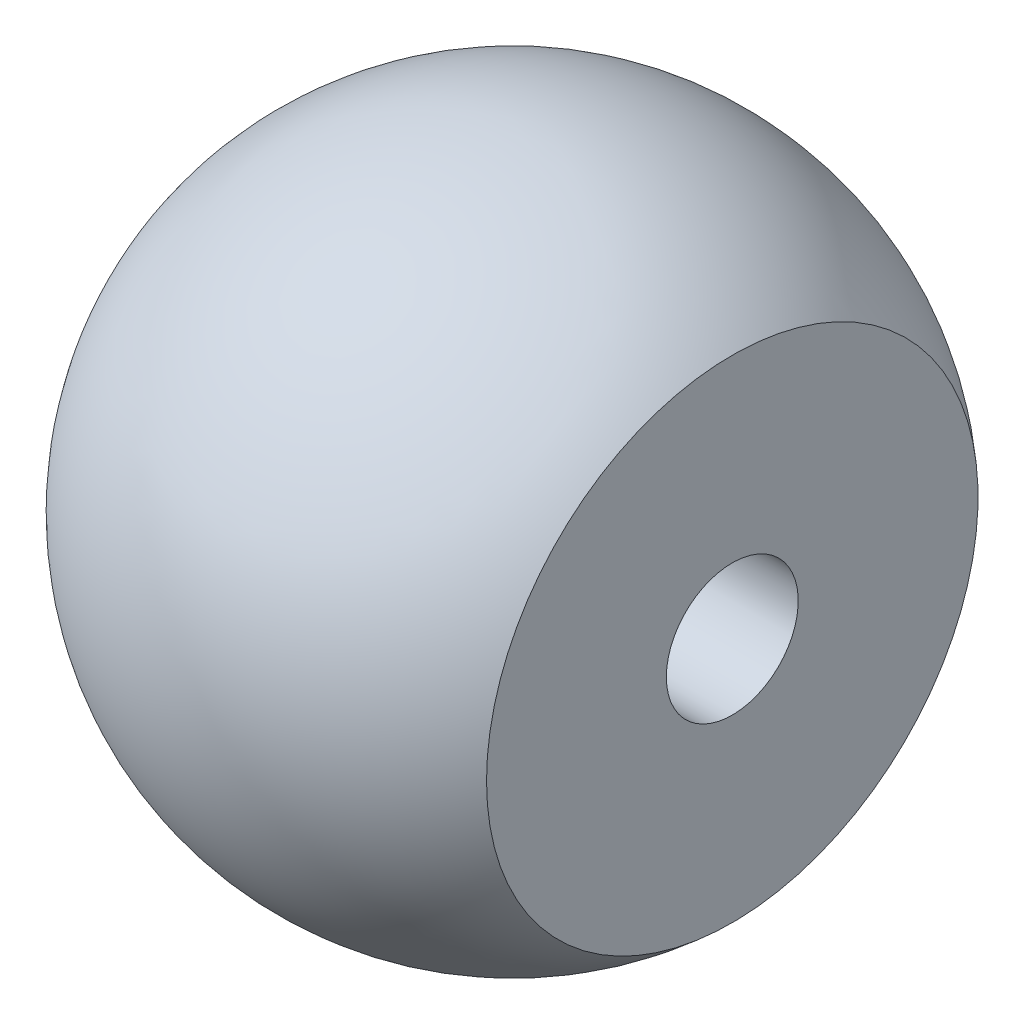
ISO-10303-21;
HEADER;
FILE_DESCRIPTION(('STEP AP214'),'2;1');
FILE_NAME('part.step','',(''),(''),'','','');
FILE_SCHEMA(('AUTOMOTIVE_DESIGN { 1 0 10303 214 1 1 1 1 }'));
ENDSEC;
DATA;
#1=APPLICATION_CONTEXT('core data for automotive mechanical design processes');
#2=APPLICATION_PROTOCOL_DEFINITION('international standard','automotive_design',2000,#1);
#3=PRODUCT_CONTEXT('',#1,'mechanical');
#4=PRODUCT('Part','Part','',(#3));
#5=PRODUCT_RELATED_PRODUCT_CATEGORY('part','',(#4));
#6=PRODUCT_DEFINITION_FORMATION('','',#4);
#7=PRODUCT_DEFINITION_CONTEXT('part definition',#1,'design');
#8=PRODUCT_DEFINITION('design','',#6,#7);
#9=PRODUCT_DEFINITION_SHAPE('','',#8);
#10=(LENGTH_UNIT() NAMED_UNIT(*) SI_UNIT(.MILLI.,.METRE.));
#11=(NAMED_UNIT(*) PLANE_ANGLE_UNIT() SI_UNIT($,.RADIAN.));
#12=(NAMED_UNIT(*) SI_UNIT($,.STERADIAN.) SOLID_ANGLE_UNIT());
#13=UNCERTAINTY_MEASURE_WITH_UNIT(LENGTH_MEASURE(1.E-05),#10,'distance_accuracy_value','');
#14=(GEOMETRIC_REPRESENTATION_CONTEXT(3) GLOBAL_UNCERTAINTY_ASSIGNED_CONTEXT((#13)) GLOBAL_UNIT_ASSIGNED_CONTEXT((#10,
#11,#12)) REPRESENTATION_CONTEXT('',''));
#15=CARTESIAN_POINT('',(0.,0.,0.));
#16=DIRECTION('',(0.,0.,1.));
#17=DIRECTION('',(1.,0.,0.));
#18=AXIS2_PLACEMENT_3D('',#15,#16,#17);
#19=CARTESIAN_POINT('',(0.,0.,0.));
#20=DIRECTION('',(0.,1.,0.));
#21=DIRECTION('',(1.,0.,0.));
#22=AXIS2_PLACEMENT_3D('',#19,#20,#21);
#23=SPHERICAL_SURFACE('',#22,30.);
#24=CARTESIAN_POINT('',(0.,0.,0.));
#25=DIRECTION('',(-1.,0.,0.));
#26=DIRECTION('',(0.,0.,1.));
#27=AXIS2_PLACEMENT_3D('',#24,#25,#26);
#28=SPHERICAL_SURFACE('',#27,30.);
#29=CARTESIAN_POINT('',(20.,0.,0.));
#30=DIRECTION('',(-1.,0.,0.));
#31=DIRECTION('',(0.,0.,1.));
#32=AXIS2_PLACEMENT_3D('',#29,#30,#31);
#33=CIRCLE('',#32,22.3606797749979);
#34=CARTESIAN_POINT('',(20.,0.,22.3606797749979));
#35=VERTEX_POINT('',#34);
#36=EDGE_CURVE('E10',#35,#35,#33,.T.);
#37=ORIENTED_EDGE('',*,*,#36,.T.);
#38=EDGE_LOOP('',(#37));
#39=FACE_BOUND('',#38,.T.);
#40=ADVANCED_FACE('F37',(#39),#28,.T.);
#41=CARTESIAN_POINT('',(20.,22.3606797749979,-30.));
#42=DIRECTION('',(-1.,0.,0.));
#43=DIRECTION('',(0.,0.,1.));
#44=AXIS2_PLACEMENT_3D('',#41,#42,#43);
#45=PLANE('',#44);
#46=CARTESIAN_POINT('',(20.,0.,0.));
#47=DIRECTION('',(-1.,0.,0.));
#48=DIRECTION('',(0.,0.,1.));
#49=AXIS2_PLACEMENT_3D('',#46,#47,#48);
#50=CIRCLE('',#49,6.);
#51=CARTESIAN_POINT('',(20.,0.,6.));
#52=VERTEX_POINT('',#51);
#53=EDGE_CURVE('E40',#52,#52,#50,.F.);
#54=ORIENTED_EDGE('',*,*,#53,.F.);
#55=EDGE_LOOP('',(#54));
#56=FACE_BOUND('',#55,.T.);
#57=ORIENTED_EDGE('',*,*,#36,.F.);
#58=EDGE_LOOP('',(#57));
#59=FACE_BOUND('',#58,.T.);
#60=ADVANCED_FACE('F57',(#56,#59),#45,.F.);
#61=CARTESIAN_POINT('',(20.000012,0.,0.));
#62=DIRECTION('',(-1.,0.,0.));
#63=DIRECTION('',(0.,0.,1.));
#64=AXIS2_PLACEMENT_3D('',#61,#62,#63);
#65=CYLINDRICAL_SURFACE('',#64,6.);
#66=CARTESIAN_POINT('',(8.,0.,0.));
#67=DIRECTION('',(1.,0.,0.));
#68=DIRECTION('',(0.,0.,-1.));
#69=AXIS2_PLACEMENT_3D('',#66,#67,#68);
#70=CIRCLE('',#69,6.);
#71=CARTESIAN_POINT('',(7.99999999999999,0.,6.));
#72=VERTEX_POINT('',#71);
#73=EDGE_CURVE('E47',#72,#72,#70,.T.);
#74=CARTESIAN_POINT('',(7.99999999999999,0.,6.));
#75=CARTESIAN_POINT('',(8.12499999999999,0.,6.));
#76=CARTESIAN_POINT('',(8.24999999999999,0.,6.));
#77=CARTESIAN_POINT('',(8.49999999999999,0.,6.));
#78=CARTESIAN_POINT('',(8.62499999999999,0.,6.));
#79=CARTESIAN_POINT('',(8.875,0.,6.));
#80=CARTESIAN_POINT('',(9.,0.,6.));
#81=CARTESIAN_POINT('',(9.25,0.,6.));
#82=CARTESIAN_POINT('',(9.375,0.,6.));
#83=CARTESIAN_POINT('',(9.625,0.,6.));
#84=CARTESIAN_POINT('',(9.75,0.,6.));
#85=CARTESIAN_POINT('',(10.,0.,6.));
#86=CARTESIAN_POINT('',(10.125,0.,6.));
#87=CARTESIAN_POINT('',(10.375,0.,6.));
#88=CARTESIAN_POINT('',(10.5,0.,6.));
#89=CARTESIAN_POINT('',(10.75,0.,6.));
#90=CARTESIAN_POINT('',(10.875,0.,6.));
#91=CARTESIAN_POINT('',(11.125,0.,6.));
#92=CARTESIAN_POINT('',(11.25,0.,6.));
#93=CARTESIAN_POINT('',(11.5,0.,6.));
#94=CARTESIAN_POINT('',(11.625,0.,6.));
#95=CARTESIAN_POINT('',(11.875,0.,6.));
#96=CARTESIAN_POINT('',(12.,0.,6.));
#97=CARTESIAN_POINT('',(12.25,0.,6.));
#98=CARTESIAN_POINT('',(12.375,0.,6.));
#99=CARTESIAN_POINT('',(12.625,0.,6.));
#100=CARTESIAN_POINT('',(12.75,0.,6.));
#101=CARTESIAN_POINT('',(13.,0.,6.));
#102=CARTESIAN_POINT('',(13.125,0.,6.));
#103=CARTESIAN_POINT('',(13.375,0.,6.));
#104=CARTESIAN_POINT('',(13.5,0.,6.));
#105=CARTESIAN_POINT('',(13.75,0.,6.));
#106=CARTESIAN_POINT('',(13.875,0.,6.));
#107=CARTESIAN_POINT('',(14.125,0.,6.));
#108=CARTESIAN_POINT('',(14.25,0.,6.));
#109=CARTESIAN_POINT('',(14.5,0.,6.));
#110=CARTESIAN_POINT('',(14.625,0.,6.));
#111=CARTESIAN_POINT('',(14.875,0.,6.));
#112=CARTESIAN_POINT('',(15.,0.,6.));
#113=CARTESIAN_POINT('',(15.25,0.,6.));
#114=CARTESIAN_POINT('',(15.375,0.,6.));
#115=CARTESIAN_POINT('',(15.625,0.,6.));
#116=CARTESIAN_POINT('',(15.75,0.,6.));
#117=CARTESIAN_POINT('',(16.,0.,6.));
#118=CARTESIAN_POINT('',(16.125,0.,6.));
#119=CARTESIAN_POINT('',(16.375,0.,6.));
#120=CARTESIAN_POINT('',(16.5,0.,6.));
#121=CARTESIAN_POINT('',(16.75,0.,6.));
#122=CARTESIAN_POINT('',(16.875,0.,6.));
#123=CARTESIAN_POINT('',(17.125,0.,6.));
#124=CARTESIAN_POINT('',(17.25,0.,6.));
#125=CARTESIAN_POINT('',(17.5,0.,6.));
#126=CARTESIAN_POINT('',(17.625,0.,6.));
#127=CARTESIAN_POINT('',(17.875,0.,6.));
#128=CARTESIAN_POINT('',(18.,0.,6.));
#129=CARTESIAN_POINT('',(18.25,0.,6.));
#130=CARTESIAN_POINT('',(18.375,0.,6.));
#131=CARTESIAN_POINT('',(18.625,0.,6.));
#132=CARTESIAN_POINT('',(18.75,0.,6.));
#133=CARTESIAN_POINT('',(19.,0.,6.));
#134=CARTESIAN_POINT('',(19.125,0.,6.));
#135=CARTESIAN_POINT('',(19.375,0.,6.));
#136=CARTESIAN_POINT('',(19.5,0.,6.));
#137=CARTESIAN_POINT('',(19.75,0.,6.));
#138=CARTESIAN_POINT('',(19.875,0.,6.));
#139=CARTESIAN_POINT('',(20.,0.,6.));
#140=B_SPLINE_CURVE_WITH_KNOTS('',3,(#74,#75,#76,#77,#78,#79,#80,#81,#82,#83,#84,#85,#86,#87,
#88,#89,#90,#91,#92,#93,#94,#95,#96,#97,#98,#99,#100,#101,#102,#103,#104,#105,#106,#107,#108,
#109,#110,#111,#112,#113,#114,#115,#116,#117,#118,#119,#120,#121,#122,#123,#124,#125,#126,#127,
#128,#129,#130,#131,#132,#133,#134,#135,#136,#137,#138,#139),.UNSPECIFIED.,.F.,.F.,(4,2,2,2,2,2,
2,2,2,2,2,2,2,2,2,2,2,2,2,2,2,2,2,2,2,2,2,2,2,2,2,2,4),(0.,0.375,0.750000000000001,1.125,1.5,
1.875,2.25,2.625,3.,3.375,3.75,4.125,4.5,4.875,5.25,5.625,6.,6.375,6.75,7.125,7.5,7.875,8.25,
8.625,9.,9.375,9.75,10.125,10.5,10.875,11.25,11.625,12.),.UNSPECIFIED.);
#141=EDGE_CURVE('BSEAM54',#72,#52,#140,.T.);
#142=ORIENTED_EDGE('',*,*,#73,.F.);
#143=ORIENTED_EDGE('',*,*,#53,.T.);
#144=ORIENTED_EDGE('',*,*,#141,.T.);
#145=ORIENTED_EDGE('',*,*,#141,.F.);
#146=EDGE_LOOP('',(#142,#144,#143,#145));
#147=FACE_BOUND('',#146,.T.);
#148=ADVANCED_FACE('F54',(#147),#65,.F.);
#149=CARTESIAN_POINT('',(8.,0.,0.));
#150=DIRECTION('',(1.,0.,0.));
#151=DIRECTION('',(0.,0.,-1.));
#152=AXIS2_PLACEMENT_3D('',#149,#150,#151);
#153=PLANE('',#152);
#154=ORIENTED_EDGE('',*,*,#73,.T.);
#155=EDGE_LOOP('',(#154));
#156=FACE_BOUND('',#155,.T.);
#157=ADVANCED_FACE('F52',(#156),#153,.T.);
#158=CLOSED_SHELL('',(#40,#60,#148,#157));
#159=MANIFOLD_SOLID_BREP('B2',#158);
#160=ADVANCED_BREP_SHAPE_REPRESENTATION('',(#18,#159),#14);
#161=SHAPE_DEFINITION_REPRESENTATION(#9,#160);
ENDSEC;
END-ISO-10303-21;
